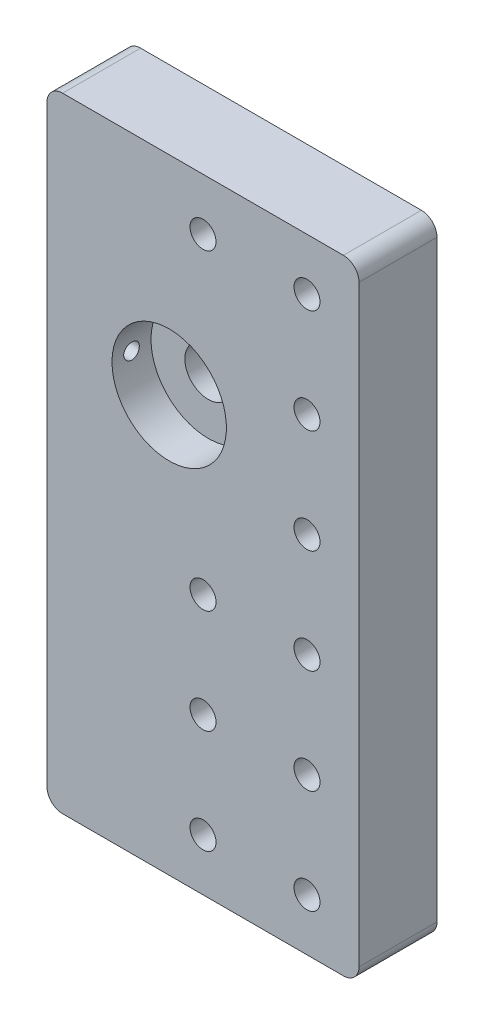
ISO-10303-21;
HEADER;
FILE_DESCRIPTION(('STEP AP214'),'2;1');
FILE_NAME('part.step','',(''),(''),'','','');
FILE_SCHEMA(('AUTOMOTIVE_DESIGN { 1 0 10303 214 1 1 1 1 }'));
ENDSEC;
DATA;
#1=APPLICATION_CONTEXT('core data for automotive mechanical design processes');
#2=APPLICATION_PROTOCOL_DEFINITION('international standard','automotive_design',2000,#1);
#3=PRODUCT_CONTEXT('',#1,'mechanical');
#4=PRODUCT('Part','Part','',(#3));
#5=PRODUCT_RELATED_PRODUCT_CATEGORY('part','',(#4));
#6=PRODUCT_DEFINITION_FORMATION('','',#4);
#7=PRODUCT_DEFINITION_CONTEXT('part definition',#1,'design');
#8=PRODUCT_DEFINITION('design','',#6,#7);
#9=PRODUCT_DEFINITION_SHAPE('','',#8);
#10=(LENGTH_UNIT() NAMED_UNIT(*) SI_UNIT(.MILLI.,.METRE.));
#11=(NAMED_UNIT(*) PLANE_ANGLE_UNIT() SI_UNIT($,.RADIAN.));
#12=(NAMED_UNIT(*) SI_UNIT($,.STERADIAN.) SOLID_ANGLE_UNIT());
#13=UNCERTAINTY_MEASURE_WITH_UNIT(LENGTH_MEASURE(1.E-05),#10,'distance_accuracy_value','');
#14=(GEOMETRIC_REPRESENTATION_CONTEXT(3) GLOBAL_UNCERTAINTY_ASSIGNED_CONTEXT((#13)) GLOBAL_UNIT_ASSIGNED_CONTEXT((#10,
#11,#12)) REPRESENTATION_CONTEXT('',''));
#15=CARTESIAN_POINT('',(0.,0.,0.));
#16=DIRECTION('',(0.,0.,1.));
#17=DIRECTION('',(1.,0.,0.));
#18=AXIS2_PLACEMENT_3D('',#15,#16,#17);
#19=CARTESIAN_POINT('',(83.5,80.,0.));
#20=DIRECTION('',(0.,0.,1.));
#21=DIRECTION('',(-1.,0.,0.));
#22=AXIS2_PLACEMENT_3D('',#19,#20,#21);
#23=CYLINDRICAL_SURFACE('',#22,4.5);
#24=CARTESIAN_POINT('',(83.5,80.,0.));
#25=DIRECTION('',(0.,0.,-1.));
#26=DIRECTION('',(-1.,0.,0.));
#27=AXIS2_PLACEMENT_3D('',#24,#25,#26);
#28=CIRCLE('',#27,4.5);
#29=CARTESIAN_POINT('',(79.,80.,0.));
#30=VERTEX_POINT('',#29);
#31=EDGE_CURVE('E289',#30,#30,#28,.T.);
#32=ORIENTED_EDGE('',*,*,#31,.T.);
#33=EDGE_LOOP('',(#32));
#34=FACE_BOUND('',#33,.T.);
#35=CARTESIAN_POINT('',(83.5,80.,7.5));
#36=DIRECTION('',(0.,0.,-1.));
#37=DIRECTION('',(-1.,0.,0.));
#38=AXIS2_PLACEMENT_3D('',#35,#36,#37);
#39=CIRCLE('',#38,4.5);
#40=CARTESIAN_POINT('',(79.,80.,7.5));
#41=VERTEX_POINT('',#40);
#42=EDGE_CURVE('E301',#41,#41,#39,.T.);
#43=ORIENTED_EDGE('',*,*,#42,.F.);
#44=EDGE_LOOP('',(#43));
#45=FACE_BOUND('',#44,.T.);
#46=ADVANCED_FACE('F42',(#34,#45),#23,.F.);
#47=CARTESIAN_POINT('',(120.,0.,15.));
#48=DIRECTION('',(0.,0.,-1.));
#49=DIRECTION('',(1.,0.,0.));
#50=AXIS2_PLACEMENT_3D('',#47,#48,#49);
#51=PLANE('',#50);
#52=CARTESIAN_POINT('',(83.5,80.,15.));
#53=DIRECTION('',(0.,0.,-1.));
#54=DIRECTION('',(-1.,0.,0.));
#55=AXIS2_PLACEMENT_3D('',#52,#53,#54);
#56=CIRCLE('',#55,11.);
#57=CARTESIAN_POINT('',(72.5,80.,15.));
#58=VERTEX_POINT('',#57);
#59=EDGE_CURVE('E297',#58,#58,#56,.T.);
#60=ORIENTED_EDGE('',*,*,#59,.T.);
#61=EDGE_LOOP('',(#60));
#62=FACE_BOUND('',#61,.T.);
#63=DIRECTION('',(0.,-1.,0.));
#64=VECTOR('',#63,1.);
#65=CARTESIAN_POINT('',(120.,0.,15.));
#66=LINE('',#65,#64);
#67=CARTESIAN_POINT('',(120.,117.,15.));
#68=VERTEX_POINT('',#67);
#69=CARTESIAN_POINT('',(120.,3.,15.));
#70=VERTEX_POINT('',#69);
#71=EDGE_CURVE('E153',#68,#70,#66,.T.);
#72=ORIENTED_EDGE('',*,*,#71,.F.);
#73=CARTESIAN_POINT('',(117.,117.,15.));
#74=DIRECTION('',(0.,0.,1.));
#75=DIRECTION('',(1.,0.,0.));
#76=AXIS2_PLACEMENT_3D('',#73,#74,#75);
#77=CIRCLE('',#76,3.);
#78=CARTESIAN_POINT('',(117.,120.,15.));
#79=VERTEX_POINT('',#78);
#80=EDGE_CURVE('E173',#79,#68,#77,.F.);
#81=ORIENTED_EDGE('',*,*,#80,.F.);
#82=DIRECTION('',(1.,0.,0.));
#83=VECTOR('',#82,1.);
#84=CARTESIAN_POINT('',(120.,120.,15.));
#85=LINE('',#84,#83);
#86=CARTESIAN_POINT('',(63.,120.,15.));
#87=VERTEX_POINT('',#86);
#88=EDGE_CURVE('E155',#87,#79,#85,.T.);
#89=ORIENTED_EDGE('',*,*,#88,.F.);
#90=CARTESIAN_POINT('',(63.,117.,15.));
#91=DIRECTION('',(0.,0.,1.));
#92=DIRECTION('',(1.,0.,0.));
#93=AXIS2_PLACEMENT_3D('',#90,#91,#92);
#94=CIRCLE('',#93,3.);
#95=CARTESIAN_POINT('',(60.,117.,15.));
#96=VERTEX_POINT('',#95);
#97=EDGE_CURVE('E170',#96,#87,#94,.F.);
#98=ORIENTED_EDGE('',*,*,#97,.F.);
#99=DIRECTION('',(0.,1.,0.));
#100=VECTOR('',#99,1.);
#101=CARTESIAN_POINT('',(60.,0.,15.));
#102=LINE('',#101,#100);
#103=CARTESIAN_POINT('',(60.,3.,15.));
#104=VERTEX_POINT('',#103);
#105=EDGE_CURVE('E200',#104,#96,#102,.T.);
#106=ORIENTED_EDGE('',*,*,#105,.F.);
#107=CARTESIAN_POINT('',(63.,3.,15.));
#108=DIRECTION('',(0.,0.,1.));
#109=DIRECTION('',(1.,0.,0.));
#110=AXIS2_PLACEMENT_3D('',#107,#108,#109);
#111=CIRCLE('',#110,3.);
#112=CARTESIAN_POINT('',(63.,0.,15.));
#113=VERTEX_POINT('',#112);
#114=EDGE_CURVE('E176',#113,#104,#111,.F.);
#115=ORIENTED_EDGE('',*,*,#114,.F.);
#116=DIRECTION('',(-1.,0.,0.));
#117=VECTOR('',#116,1.);
#118=CARTESIAN_POINT('',(120.,0.,15.));
#119=LINE('',#118,#117);
#120=CARTESIAN_POINT('',(117.,0.,15.));
#121=VERTEX_POINT('',#120);
#122=EDGE_CURVE('E204',#121,#113,#119,.T.);
#123=ORIENTED_EDGE('',*,*,#122,.F.);
#124=CARTESIAN_POINT('',(117.,3.,15.));
#125=DIRECTION('',(0.,0.,1.));
#126=DIRECTION('',(1.,0.,0.));
#127=AXIS2_PLACEMENT_3D('',#124,#125,#126);
#128=CIRCLE('',#127,3.);
#129=EDGE_CURVE('E112',#70,#121,#128,.F.);
#130=ORIENTED_EDGE('',*,*,#129,.F.);
#131=EDGE_LOOP('',(#72,#81,#89,#98,#106,#115,#123,#130));
#132=FACE_BOUND('',#131,.T.);
#133=CARTESIAN_POINT('',(110.,110.,15.));
#134=DIRECTION('',(0.,0.,-1.));
#135=DIRECTION('',(-1.,0.,0.));
#136=AXIS2_PLACEMENT_3D('',#133,#134,#135);
#137=CIRCLE('',#136,2.5);
#138=CARTESIAN_POINT('',(107.5,110.,15.));
#139=VERTEX_POINT('',#138);
#140=EDGE_CURVE('E146',#139,#139,#137,.T.);
#141=ORIENTED_EDGE('',*,*,#140,.T.);
#142=EDGE_LOOP('',(#141));
#143=FACE_BOUND('',#142,.T.);
#144=CARTESIAN_POINT('',(90.,110.,15.));
#145=DIRECTION('',(0.,0.,-1.));
#146=DIRECTION('',(-1.,0.,0.));
#147=AXIS2_PLACEMENT_3D('',#144,#145,#146);
#148=CIRCLE('',#147,2.5);
#149=CARTESIAN_POINT('',(87.5,110.,15.));
#150=VERTEX_POINT('',#149);
#151=EDGE_CURVE('E221',#150,#150,#148,.T.);
#152=ORIENTED_EDGE('',*,*,#151,.T.);
#153=EDGE_LOOP('',(#152));
#154=FACE_BOUND('',#153,.T.);
#155=CARTESIAN_POINT('',(110.,90.,15.));
#156=DIRECTION('',(0.,0.,-1.));
#157=DIRECTION('',(-1.,0.,0.));
#158=AXIS2_PLACEMENT_3D('',#155,#156,#157);
#159=CIRCLE('',#158,2.5);
#160=CARTESIAN_POINT('',(107.5,90.,15.));
#161=VERTEX_POINT('',#160);
#162=EDGE_CURVE('E229',#161,#161,#159,.T.);
#163=ORIENTED_EDGE('',*,*,#162,.T.);
#164=EDGE_LOOP('',(#163));
#165=FACE_BOUND('',#164,.T.);
#166=CARTESIAN_POINT('',(110.,70.,15.));
#167=DIRECTION('',(0.,0.,-1.));
#168=DIRECTION('',(-1.,0.,0.));
#169=AXIS2_PLACEMENT_3D('',#166,#167,#168);
#170=CIRCLE('',#169,2.5);
#171=CARTESIAN_POINT('',(107.5,70.,15.));
#172=VERTEX_POINT('',#171);
#173=EDGE_CURVE('E237',#172,#172,#170,.T.);
#174=ORIENTED_EDGE('',*,*,#173,.T.);
#175=EDGE_LOOP('',(#174));
#176=FACE_BOUND('',#175,.T.);
#177=CARTESIAN_POINT('',(110.,30.,15.));
#178=DIRECTION('',(0.,0.,-1.));
#179=DIRECTION('',(-1.,0.,0.));
#180=AXIS2_PLACEMENT_3D('',#177,#178,#179);
#181=CIRCLE('',#180,2.5);
#182=CARTESIAN_POINT('',(107.5,30.,15.));
#183=VERTEX_POINT('',#182);
#184=EDGE_CURVE('E244',#183,#183,#181,.T.);
#185=ORIENTED_EDGE('',*,*,#184,.T.);
#186=EDGE_LOOP('',(#185));
#187=FACE_BOUND('',#186,.T.);
#188=CARTESIAN_POINT('',(110.,10.,15.));
#189=DIRECTION('',(0.,0.,-1.));
#190=DIRECTION('',(-1.,0.,0.));
#191=AXIS2_PLACEMENT_3D('',#188,#189,#190);
#192=CIRCLE('',#191,2.5);
#193=CARTESIAN_POINT('',(107.5,10.,15.));
#194=VERTEX_POINT('',#193);
#195=EDGE_CURVE('E252',#194,#194,#192,.T.);
#196=ORIENTED_EDGE('',*,*,#195,.T.);
#197=EDGE_LOOP('',(#196));
#198=FACE_BOUND('',#197,.T.);
#199=CARTESIAN_POINT('',(90.,10.,15.));
#200=DIRECTION('',(0.,0.,-1.));
#201=DIRECTION('',(-1.,0.,0.));
#202=AXIS2_PLACEMENT_3D('',#199,#200,#201);
#203=CIRCLE('',#202,2.5);
#204=CARTESIAN_POINT('',(87.5,10.,15.));
#205=VERTEX_POINT('',#204);
#206=EDGE_CURVE('E259',#205,#205,#203,.T.);
#207=ORIENTED_EDGE('',*,*,#206,.T.);
#208=EDGE_LOOP('',(#207));
#209=FACE_BOUND('',#208,.T.);
#210=CARTESIAN_POINT('',(110.,50.,15.));
#211=DIRECTION('',(0.,0.,-1.));
#212=DIRECTION('',(-1.,0.,0.));
#213=AXIS2_PLACEMENT_3D('',#210,#211,#212);
#214=CIRCLE('',#213,2.5);
#215=CARTESIAN_POINT('',(107.5,50.,15.));
#216=VERTEX_POINT('',#215);
#217=EDGE_CURVE('E266',#216,#216,#214,.T.);
#218=ORIENTED_EDGE('',*,*,#217,.T.);
#219=EDGE_LOOP('',(#218));
#220=FACE_BOUND('',#219,.T.);
#221=CARTESIAN_POINT('',(90.,50.,15.));
#222=DIRECTION('',(0.,0.,-1.));
#223=DIRECTION('',(-1.,0.,0.));
#224=AXIS2_PLACEMENT_3D('',#221,#222,#223);
#225=CIRCLE('',#224,2.5);
#226=CARTESIAN_POINT('',(87.5,50.,15.));
#227=VERTEX_POINT('',#226);
#228=EDGE_CURVE('E274',#227,#227,#225,.T.);
#229=ORIENTED_EDGE('',*,*,#228,.T.);
#230=EDGE_LOOP('',(#229));
#231=FACE_BOUND('',#230,.T.);
#232=CARTESIAN_POINT('',(90.,30.,15.));
#233=DIRECTION('',(0.,0.,-1.));
#234=DIRECTION('',(-1.,0.,0.));
#235=AXIS2_PLACEMENT_3D('',#232,#233,#234);
#236=CIRCLE('',#235,2.5);
#237=CARTESIAN_POINT('',(87.5,30.,15.));
#238=VERTEX_POINT('',#237);
#239=EDGE_CURVE('E282',#238,#238,#236,.T.);
#240=ORIENTED_EDGE('',*,*,#239,.T.);
#241=EDGE_LOOP('',(#240));
#242=FACE_BOUND('',#241,.T.);
#243=ADVANCED_FACE('F207',(#62,#132,#143,#154,#165,#176,#187,#198,#209,#220,#231,#242),#51,.F.);
#244=CARTESIAN_POINT('',(120.,0.,0.));
#245=DIRECTION('',(0.,0.,-1.));
#246=DIRECTION('',(1.,0.,0.));
#247=AXIS2_PLACEMENT_3D('',#244,#245,#246);
#248=PLANE('',#247);
#249=ORIENTED_EDGE('',*,*,#31,.F.);
#250=EDGE_LOOP('',(#249));
#251=FACE_BOUND('',#250,.T.);
#252=CARTESIAN_POINT('',(90.,50.,0.));
#253=DIRECTION('',(0.,0.,-1.));
#254=DIRECTION('',(-1.,0.,0.));
#255=AXIS2_PLACEMENT_3D('',#252,#253,#254);
#256=CIRCLE('',#255,2.5);
#257=CARTESIAN_POINT('',(87.5,50.,0.));
#258=VERTEX_POINT('',#257);
#259=EDGE_CURVE('E278',#258,#258,#256,.T.);
#260=ORIENTED_EDGE('',*,*,#259,.F.);
#261=EDGE_LOOP('',(#260));
#262=FACE_BOUND('',#261,.T.);
#263=CARTESIAN_POINT('',(90.,10.,0.));
#264=DIRECTION('',(0.,0.,-1.));
#265=DIRECTION('',(-1.,0.,0.));
#266=AXIS2_PLACEMENT_3D('',#263,#264,#265);
#267=CIRCLE('',#266,2.5);
#268=CARTESIAN_POINT('',(87.5,10.,0.));
#269=VERTEX_POINT('',#268);
#270=EDGE_CURVE('E262',#269,#269,#267,.T.);
#271=ORIENTED_EDGE('',*,*,#270,.F.);
#272=EDGE_LOOP('',(#271));
#273=FACE_BOUND('',#272,.T.);
#274=CARTESIAN_POINT('',(110.,30.,0.));
#275=DIRECTION('',(0.,0.,-1.));
#276=DIRECTION('',(-1.,0.,0.));
#277=AXIS2_PLACEMENT_3D('',#274,#275,#276);
#278=CIRCLE('',#277,2.5);
#279=CARTESIAN_POINT('',(107.5,30.,0.));
#280=VERTEX_POINT('',#279);
#281=EDGE_CURVE('E248',#280,#280,#278,.T.);
#282=ORIENTED_EDGE('',*,*,#281,.F.);
#283=EDGE_LOOP('',(#282));
#284=FACE_BOUND('',#283,.T.);
#285=CARTESIAN_POINT('',(110.,90.,0.));
#286=DIRECTION('',(0.,0.,-1.));
#287=DIRECTION('',(-1.,0.,0.));
#288=AXIS2_PLACEMENT_3D('',#285,#286,#287);
#289=CIRCLE('',#288,2.5);
#290=CARTESIAN_POINT('',(107.5,90.,0.));
#291=VERTEX_POINT('',#290);
#292=EDGE_CURVE('E233',#291,#291,#289,.T.);
#293=ORIENTED_EDGE('',*,*,#292,.F.);
#294=EDGE_LOOP('',(#293));
#295=FACE_BOUND('',#294,.T.);
#296=CARTESIAN_POINT('',(110.,110.,0.));
#297=DIRECTION('',(0.,0.,-1.));
#298=DIRECTION('',(-1.,0.,0.));
#299=AXIS2_PLACEMENT_3D('',#296,#297,#298);
#300=CIRCLE('',#299,2.5);
#301=CARTESIAN_POINT('',(107.5,110.,0.));
#302=VERTEX_POINT('',#301);
#303=EDGE_CURVE('E217',#302,#302,#300,.T.);
#304=ORIENTED_EDGE('',*,*,#303,.F.);
#305=EDGE_LOOP('',(#304));
#306=FACE_BOUND('',#305,.T.);
#307=DIRECTION('',(-1.,0.,0.));
#308=VECTOR('',#307,1.);
#309=CARTESIAN_POINT('',(120.,0.,0.));
#310=LINE('',#309,#308);
#311=CARTESIAN_POINT('',(117.,0.,0.));
#312=VERTEX_POINT('',#311);
#313=CARTESIAN_POINT('',(63.,0.,0.));
#314=VERTEX_POINT('',#313);
#315=EDGE_CURVE('E126',#312,#314,#310,.T.);
#316=ORIENTED_EDGE('',*,*,#315,.T.);
#317=CARTESIAN_POINT('',(63.,3.,0.));
#318=DIRECTION('',(0.,0.,1.));
#319=DIRECTION('',(1.,0.,0.));
#320=AXIS2_PLACEMENT_3D('',#317,#318,#319);
#321=CIRCLE('',#320,3.);
#322=CARTESIAN_POINT('',(60.,3.,0.));
#323=VERTEX_POINT('',#322);
#324=EDGE_CURVE('E132',#323,#314,#321,.T.);
#325=ORIENTED_EDGE('',*,*,#324,.F.);
#326=DIRECTION('',(0.,1.,0.));
#327=VECTOR('',#326,1.);
#328=CARTESIAN_POINT('',(60.,0.,0.));
#329=LINE('',#328,#327);
#330=CARTESIAN_POINT('',(60.,117.,0.));
#331=VERTEX_POINT('',#330);
#332=EDGE_CURVE('E137',#323,#331,#329,.T.);
#333=ORIENTED_EDGE('',*,*,#332,.T.);
#334=CARTESIAN_POINT('',(63.,117.,0.));
#335=DIRECTION('',(0.,0.,1.));
#336=DIRECTION('',(1.,0.,0.));
#337=AXIS2_PLACEMENT_3D('',#334,#335,#336);
#338=CIRCLE('',#337,3.);
#339=CARTESIAN_POINT('',(63.,120.,0.));
#340=VERTEX_POINT('',#339);
#341=EDGE_CURVE('E118',#340,#331,#338,.T.);
#342=ORIENTED_EDGE('',*,*,#341,.F.);
#343=DIRECTION('',(1.,0.,0.));
#344=VECTOR('',#343,1.);
#345=CARTESIAN_POINT('',(120.,120.,0.));
#346=LINE('',#345,#344);
#347=CARTESIAN_POINT('',(117.,120.,0.));
#348=VERTEX_POINT('',#347);
#349=EDGE_CURVE('E143',#340,#348,#346,.T.);
#350=ORIENTED_EDGE('',*,*,#349,.T.);
#351=CARTESIAN_POINT('',(117.,117.,0.));
#352=DIRECTION('',(0.,0.,1.));
#353=DIRECTION('',(1.,0.,0.));
#354=AXIS2_PLACEMENT_3D('',#351,#352,#353);
#355=CIRCLE('',#354,3.);
#356=CARTESIAN_POINT('',(120.,117.,0.));
#357=VERTEX_POINT('',#356);
#358=EDGE_CURVE('E160',#357,#348,#355,.T.);
#359=ORIENTED_EDGE('',*,*,#358,.F.);
#360=DIRECTION('',(0.,-1.,0.));
#361=VECTOR('',#360,1.);
#362=CARTESIAN_POINT('',(120.,0.,0.));
#363=LINE('',#362,#361);
#364=CARTESIAN_POINT('',(120.,3.,0.));
#365=VERTEX_POINT('',#364);
#366=EDGE_CURVE('E129',#357,#365,#363,.T.);
#367=ORIENTED_EDGE('',*,*,#366,.T.);
#368=CARTESIAN_POINT('',(117.,3.,0.));
#369=DIRECTION('',(0.,0.,1.));
#370=DIRECTION('',(1.,0.,0.));
#371=AXIS2_PLACEMENT_3D('',#368,#369,#370);
#372=CIRCLE('',#371,3.);
#373=EDGE_CURVE('E109',#312,#365,#372,.T.);
#374=ORIENTED_EDGE('',*,*,#373,.F.);
#375=EDGE_LOOP('',(#316,#325,#333,#342,#350,#359,#367,#374));
#376=FACE_BOUND('',#375,.T.);
#377=CARTESIAN_POINT('',(90.,110.,0.));
#378=DIRECTION('',(0.,0.,-1.));
#379=DIRECTION('',(-1.,0.,0.));
#380=AXIS2_PLACEMENT_3D('',#377,#378,#379);
#381=CIRCLE('',#380,2.5);
#382=CARTESIAN_POINT('',(87.5,110.,0.));
#383=VERTEX_POINT('',#382);
#384=EDGE_CURVE('E225',#383,#383,#381,.T.);
#385=ORIENTED_EDGE('',*,*,#384,.F.);
#386=EDGE_LOOP('',(#385));
#387=FACE_BOUND('',#386,.T.);
#388=CARTESIAN_POINT('',(110.,70.,0.));
#389=DIRECTION('',(0.,0.,-1.));
#390=DIRECTION('',(-1.,0.,0.));
#391=AXIS2_PLACEMENT_3D('',#388,#389,#390);
#392=CIRCLE('',#391,2.5);
#393=CARTESIAN_POINT('',(107.5,70.,0.));
#394=VERTEX_POINT('',#393);
#395=EDGE_CURVE('E240',#394,#394,#392,.T.);
#396=ORIENTED_EDGE('',*,*,#395,.F.);
#397=EDGE_LOOP('',(#396));
#398=FACE_BOUND('',#397,.T.);
#399=CARTESIAN_POINT('',(110.,10.,0.));
#400=DIRECTION('',(0.,0.,-1.));
#401=DIRECTION('',(-1.,0.,0.));
#402=AXIS2_PLACEMENT_3D('',#399,#400,#401);
#403=CIRCLE('',#402,2.5);
#404=CARTESIAN_POINT('',(107.5,10.,0.));
#405=VERTEX_POINT('',#404);
#406=EDGE_CURVE('E256',#405,#405,#403,.T.);
#407=ORIENTED_EDGE('',*,*,#406,.F.);
#408=EDGE_LOOP('',(#407));
#409=FACE_BOUND('',#408,.T.);
#410=CARTESIAN_POINT('',(110.,50.,0.));
#411=DIRECTION('',(0.,0.,-1.));
#412=DIRECTION('',(-1.,0.,0.));
#413=AXIS2_PLACEMENT_3D('',#410,#411,#412);
#414=CIRCLE('',#413,2.5);
#415=CARTESIAN_POINT('',(107.5,50.,0.));
#416=VERTEX_POINT('',#415);
#417=EDGE_CURVE('E270',#416,#416,#414,.T.);
#418=ORIENTED_EDGE('',*,*,#417,.F.);
#419=EDGE_LOOP('',(#418));
#420=FACE_BOUND('',#419,.T.);
#421=CARTESIAN_POINT('',(90.,30.,0.));
#422=DIRECTION('',(0.,0.,-1.));
#423=DIRECTION('',(-1.,0.,0.));
#424=AXIS2_PLACEMENT_3D('',#421,#422,#423);
#425=CIRCLE('',#424,2.5);
#426=CARTESIAN_POINT('',(87.5,30.,0.));
#427=VERTEX_POINT('',#426);
#428=EDGE_CURVE('E285',#427,#427,#425,.T.);
#429=ORIENTED_EDGE('',*,*,#428,.F.);
#430=EDGE_LOOP('',(#429));
#431=FACE_BOUND('',#430,.T.);
#432=ADVANCED_FACE('F123',(#251,#262,#273,#284,#295,#306,#376,#387,#398,#409,#420,#431),#248,.T.);
#433=CARTESIAN_POINT('',(120.,0.,15.));
#434=DIRECTION('',(-1.,0.,0.));
#435=DIRECTION('',(0.,0.,-1.));
#436=AXIS2_PLACEMENT_3D('',#433,#434,#435);
#437=PLANE('',#436);
#438=ORIENTED_EDGE('',*,*,#366,.F.);
#439=DIRECTION('',(0.,0.,-1.));
#440=VECTOR('',#439,1.);
#441=CARTESIAN_POINT('',(120.,117.,15.));
#442=LINE('',#441,#440);
#443=EDGE_CURVE('E131',#68,#357,#442,.T.);
#444=ORIENTED_EDGE('',*,*,#443,.F.);
#445=ORIENTED_EDGE('',*,*,#71,.T.);
#446=DIRECTION('',(0.,0.,-1.));
#447=VECTOR('',#446,1.);
#448=CARTESIAN_POINT('',(120.,3.,15.));
#449=LINE('',#448,#447);
#450=EDGE_CURVE('E167',#365,#70,#449,.F.);
#451=ORIENTED_EDGE('',*,*,#450,.F.);
#452=EDGE_LOOP('',(#438,#444,#445,#451));
#453=FACE_BOUND('',#452,.T.);
#454=ADVANCED_FACE('F382',(#453),#437,.F.);
#455=CARTESIAN_POINT('',(120.,0.,15.));
#456=DIRECTION('',(0.,1.,0.));
#457=DIRECTION('',(0.,0.,1.));
#458=AXIS2_PLACEMENT_3D('',#455,#456,#457);
#459=PLANE('',#458);
#460=ORIENTED_EDGE('',*,*,#122,.T.);
#461=DIRECTION('',(0.,0.,-1.));
#462=VECTOR('',#461,1.);
#463=CARTESIAN_POINT('',(63.,0.,15.));
#464=LINE('',#463,#462);
#465=EDGE_CURVE('E119',#314,#113,#464,.F.);
#466=ORIENTED_EDGE('',*,*,#465,.F.);
#467=ORIENTED_EDGE('',*,*,#315,.F.);
#468=DIRECTION('',(0.,0.,-1.));
#469=VECTOR('',#468,1.);
#470=CARTESIAN_POINT('',(117.,0.,15.));
#471=LINE('',#470,#469);
#472=EDGE_CURVE('E106',#121,#312,#471,.T.);
#473=ORIENTED_EDGE('',*,*,#472,.F.);
#474=EDGE_LOOP('',(#460,#466,#467,#473));
#475=FACE_BOUND('',#474,.T.);
#476=ADVANCED_FACE('F134',(#475),#459,.F.);
#477=CARTESIAN_POINT('',(60.,0.,15.));
#478=DIRECTION('',(1.,0.,0.));
#479=DIRECTION('',(0.,0.,1.));
#480=AXIS2_PLACEMENT_3D('',#477,#478,#479);
#481=PLANE('',#480);
#482=CARTESIAN_POINT('',(60.,80.,11.25));
#483=DIRECTION('',(-1.,0.,0.));
#484=DIRECTION('',(0.,0.,1.));
#485=AXIS2_PLACEMENT_3D('',#482,#483,#484);
#486=CIRCLE('',#485,1.5);
#487=CARTESIAN_POINT('',(60.,80.,12.75));
#488=VERTEX_POINT('',#487);
#489=EDGE_CURVE('E302',#488,#488,#486,.T.);
#490=ORIENTED_EDGE('',*,*,#489,.F.);
#491=EDGE_LOOP('',(#490));
#492=FACE_BOUND('',#491,.T.);
#493=ORIENTED_EDGE('',*,*,#105,.T.);
#494=DIRECTION('',(0.,0.,-1.));
#495=VECTOR('',#494,1.);
#496=CARTESIAN_POINT('',(60.,117.,15.));
#497=LINE('',#496,#495);
#498=EDGE_CURVE('E182',#331,#96,#497,.F.);
#499=ORIENTED_EDGE('',*,*,#498,.F.);
#500=ORIENTED_EDGE('',*,*,#332,.F.);
#501=DIRECTION('',(0.,0.,-1.));
#502=VECTOR('',#501,1.);
#503=CARTESIAN_POINT('',(60.,3.,15.));
#504=LINE('',#503,#502);
#505=EDGE_CURVE('E185',#104,#323,#504,.T.);
#506=ORIENTED_EDGE('',*,*,#505,.F.);
#507=EDGE_LOOP('',(#493,#499,#500,#506));
#508=FACE_BOUND('',#507,.T.);
#509=ADVANCED_FACE('F198',(#492,#508),#481,.F.);
#510=CARTESIAN_POINT('',(120.,120.,15.));
#511=DIRECTION('',(0.,-1.,0.));
#512=DIRECTION('',(0.,0.,-1.));
#513=AXIS2_PLACEMENT_3D('',#510,#511,#512);
#514=PLANE('',#513);
#515=ORIENTED_EDGE('',*,*,#349,.F.);
#516=DIRECTION('',(0.,0.,-1.));
#517=VECTOR('',#516,1.);
#518=CARTESIAN_POINT('',(63.,120.,15.));
#519=LINE('',#518,#517);
#520=EDGE_CURVE('E51',#87,#340,#519,.T.);
#521=ORIENTED_EDGE('',*,*,#520,.F.);
#522=ORIENTED_EDGE('',*,*,#88,.T.);
#523=DIRECTION('',(0.,0.,-1.));
#524=VECTOR('',#523,1.);
#525=CARTESIAN_POINT('',(117.,120.,15.));
#526=LINE('',#525,#524);
#527=EDGE_CURVE('E11',#348,#79,#526,.F.);
#528=ORIENTED_EDGE('',*,*,#527,.F.);
#529=EDGE_LOOP('',(#515,#521,#522,#528));
#530=FACE_BOUND('',#529,.T.);
#531=ADVANCED_FACE('F194',(#530),#514,.F.);
#532=CARTESIAN_POINT('',(110.,110.,15.));
#533=DIRECTION('',(0.,0.,-1.));
#534=DIRECTION('',(1.,0.,0.));
#535=AXIS2_PLACEMENT_3D('',#532,#533,#534);
#536=CYLINDRICAL_SURFACE('',#535,2.5);
#537=ORIENTED_EDGE('',*,*,#140,.F.);
#538=EDGE_LOOP('',(#537));
#539=FACE_BOUND('',#538,.T.);
#540=ORIENTED_EDGE('',*,*,#303,.T.);
#541=EDGE_LOOP('',(#540));
#542=FACE_BOUND('',#541,.T.);
#543=ADVANCED_FACE('F372',(#539,#542),#536,.F.);
#544=CARTESIAN_POINT('',(90.,110.,15.));
#545=DIRECTION('',(0.,0.,-1.));
#546=DIRECTION('',(1.,0.,0.));
#547=AXIS2_PLACEMENT_3D('',#544,#545,#546);
#548=CYLINDRICAL_SURFACE('',#547,2.5);
#549=ORIENTED_EDGE('',*,*,#151,.F.);
#550=EDGE_LOOP('',(#549));
#551=FACE_BOUND('',#550,.T.);
#552=ORIENTED_EDGE('',*,*,#384,.T.);
#553=EDGE_LOOP('',(#552));
#554=FACE_BOUND('',#553,.T.);
#555=ADVANCED_FACE('F368',(#551,#554),#548,.F.);
#556=CARTESIAN_POINT('',(110.,90.,15.));
#557=DIRECTION('',(0.,0.,-1.));
#558=DIRECTION('',(1.,0.,0.));
#559=AXIS2_PLACEMENT_3D('',#556,#557,#558);
#560=CYLINDRICAL_SURFACE('',#559,2.5);
#561=ORIENTED_EDGE('',*,*,#162,.F.);
#562=EDGE_LOOP('',(#561));
#563=FACE_BOUND('',#562,.T.);
#564=ORIENTED_EDGE('',*,*,#292,.T.);
#565=EDGE_LOOP('',(#564));
#566=FACE_BOUND('',#565,.T.);
#567=ADVANCED_FACE('F364',(#563,#566),#560,.F.);
#568=CARTESIAN_POINT('',(110.,70.,15.));
#569=DIRECTION('',(0.,0.,-1.));
#570=DIRECTION('',(1.,0.,0.));
#571=AXIS2_PLACEMENT_3D('',#568,#569,#570);
#572=CYLINDRICAL_SURFACE('',#571,2.5);
#573=ORIENTED_EDGE('',*,*,#173,.F.);
#574=EDGE_LOOP('',(#573));
#575=FACE_BOUND('',#574,.T.);
#576=ORIENTED_EDGE('',*,*,#395,.T.);
#577=EDGE_LOOP('',(#576));
#578=FACE_BOUND('',#577,.T.);
#579=ADVANCED_FACE('F360',(#575,#578),#572,.F.);
#580=CARTESIAN_POINT('',(110.,30.,15.));
#581=DIRECTION('',(0.,0.,-1.));
#582=DIRECTION('',(1.,0.,0.));
#583=AXIS2_PLACEMENT_3D('',#580,#581,#582);
#584=CYLINDRICAL_SURFACE('',#583,2.5);
#585=ORIENTED_EDGE('',*,*,#184,.F.);
#586=EDGE_LOOP('',(#585));
#587=FACE_BOUND('',#586,.T.);
#588=ORIENTED_EDGE('',*,*,#281,.T.);
#589=EDGE_LOOP('',(#588));
#590=FACE_BOUND('',#589,.T.);
#591=ADVANCED_FACE('F356',(#587,#590),#584,.F.);
#592=CARTESIAN_POINT('',(110.,10.,15.));
#593=DIRECTION('',(0.,0.,-1.));
#594=DIRECTION('',(1.,0.,0.));
#595=AXIS2_PLACEMENT_3D('',#592,#593,#594);
#596=CYLINDRICAL_SURFACE('',#595,2.5);
#597=ORIENTED_EDGE('',*,*,#195,.F.);
#598=EDGE_LOOP('',(#597));
#599=FACE_BOUND('',#598,.T.);
#600=ORIENTED_EDGE('',*,*,#406,.T.);
#601=EDGE_LOOP('',(#600));
#602=FACE_BOUND('',#601,.T.);
#603=ADVANCED_FACE('F352',(#599,#602),#596,.F.);
#604=CARTESIAN_POINT('',(90.,10.,15.));
#605=DIRECTION('',(0.,0.,-1.));
#606=DIRECTION('',(1.,0.,0.));
#607=AXIS2_PLACEMENT_3D('',#604,#605,#606);
#608=CYLINDRICAL_SURFACE('',#607,2.5);
#609=ORIENTED_EDGE('',*,*,#206,.F.);
#610=EDGE_LOOP('',(#609));
#611=FACE_BOUND('',#610,.T.);
#612=ORIENTED_EDGE('',*,*,#270,.T.);
#613=EDGE_LOOP('',(#612));
#614=FACE_BOUND('',#613,.T.);
#615=ADVANCED_FACE('F348',(#611,#614),#608,.F.);
#616=CARTESIAN_POINT('',(110.,50.,15.));
#617=DIRECTION('',(0.,0.,-1.));
#618=DIRECTION('',(1.,0.,0.));
#619=AXIS2_PLACEMENT_3D('',#616,#617,#618);
#620=CYLINDRICAL_SURFACE('',#619,2.5);
#621=ORIENTED_EDGE('',*,*,#217,.F.);
#622=EDGE_LOOP('',(#621));
#623=FACE_BOUND('',#622,.T.);
#624=ORIENTED_EDGE('',*,*,#417,.T.);
#625=EDGE_LOOP('',(#624));
#626=FACE_BOUND('',#625,.T.);
#627=ADVANCED_FACE('F344',(#623,#626),#620,.F.);
#628=CARTESIAN_POINT('',(90.,50.,15.));
#629=DIRECTION('',(0.,0.,-1.));
#630=DIRECTION('',(1.,0.,0.));
#631=AXIS2_PLACEMENT_3D('',#628,#629,#630);
#632=CYLINDRICAL_SURFACE('',#631,2.5);
#633=ORIENTED_EDGE('',*,*,#228,.F.);
#634=EDGE_LOOP('',(#633));
#635=FACE_BOUND('',#634,.T.);
#636=ORIENTED_EDGE('',*,*,#259,.T.);
#637=EDGE_LOOP('',(#636));
#638=FACE_BOUND('',#637,.T.);
#639=ADVANCED_FACE('F340',(#635,#638),#632,.F.);
#640=CARTESIAN_POINT('',(90.,30.,15.));
#641=DIRECTION('',(0.,0.,-1.));
#642=DIRECTION('',(1.,0.,0.));
#643=AXIS2_PLACEMENT_3D('',#640,#641,#642);
#644=CYLINDRICAL_SURFACE('',#643,2.5);
#645=ORIENTED_EDGE('',*,*,#239,.F.);
#646=EDGE_LOOP('',(#645));
#647=FACE_BOUND('',#646,.T.);
#648=ORIENTED_EDGE('',*,*,#428,.T.);
#649=EDGE_LOOP('',(#648));
#650=FACE_BOUND('',#649,.T.);
#651=ADVANCED_FACE('F337',(#647,#650),#644,.F.);
#652=CARTESIAN_POINT('',(117.,3.,15.));
#653=DIRECTION('',(0.,0.,-1.));
#654=DIRECTION('',(1.,0.,0.));
#655=AXIS2_PLACEMENT_3D('',#652,#653,#654);
#656=CYLINDRICAL_SURFACE('',#655,3.);
#657=ORIENTED_EDGE('',*,*,#129,.T.);
#658=ORIENTED_EDGE('',*,*,#472,.T.);
#659=ORIENTED_EDGE('',*,*,#373,.T.);
#660=ORIENTED_EDGE('',*,*,#450,.T.);
#661=EDGE_LOOP('',(#657,#658,#659,#660));
#662=FACE_BOUND('',#661,.T.);
#663=ADVANCED_FACE('F108',(#662),#656,.T.);
#664=CARTESIAN_POINT('',(63.,3.,15.));
#665=DIRECTION('',(0.,0.,-1.));
#666=DIRECTION('',(1.,0.,0.));
#667=AXIS2_PLACEMENT_3D('',#664,#665,#666);
#668=CYLINDRICAL_SURFACE('',#667,3.);
#669=ORIENTED_EDGE('',*,*,#114,.T.);
#670=ORIENTED_EDGE('',*,*,#505,.T.);
#671=ORIENTED_EDGE('',*,*,#324,.T.);
#672=ORIENTED_EDGE('',*,*,#465,.T.);
#673=EDGE_LOOP('',(#669,#670,#671,#672));
#674=FACE_BOUND('',#673,.T.);
#675=ADVANCED_FACE('F396',(#674),#668,.T.);
#676=CARTESIAN_POINT('',(117.,117.,15.));
#677=DIRECTION('',(0.,0.,-1.));
#678=DIRECTION('',(1.,0.,0.));
#679=AXIS2_PLACEMENT_3D('',#676,#677,#678);
#680=CYLINDRICAL_SURFACE('',#679,3.);
#681=ORIENTED_EDGE('',*,*,#80,.T.);
#682=ORIENTED_EDGE('',*,*,#443,.T.);
#683=ORIENTED_EDGE('',*,*,#358,.T.);
#684=ORIENTED_EDGE('',*,*,#527,.T.);
#685=EDGE_LOOP('',(#681,#682,#683,#684));
#686=FACE_BOUND('',#685,.T.);
#687=ADVANCED_FACE('F398',(#686),#680,.T.);
#688=CARTESIAN_POINT('',(63.,117.,15.));
#689=DIRECTION('',(0.,0.,-1.));
#690=DIRECTION('',(1.,0.,0.));
#691=AXIS2_PLACEMENT_3D('',#688,#689,#690);
#692=CYLINDRICAL_SURFACE('',#691,3.);
#693=ORIENTED_EDGE('',*,*,#97,.T.);
#694=ORIENTED_EDGE('',*,*,#520,.T.);
#695=ORIENTED_EDGE('',*,*,#341,.T.);
#696=ORIENTED_EDGE('',*,*,#498,.T.);
#697=EDGE_LOOP('',(#693,#694,#695,#696));
#698=FACE_BOUND('',#697,.T.);
#699=ADVANCED_FACE('F44',(#698),#692,.T.);
#700=CARTESIAN_POINT('',(83.5,80.,7.5));
#701=DIRECTION('',(0.,0.,1.));
#702=DIRECTION('',(-1.,0.,0.));
#703=AXIS2_PLACEMENT_3D('',#700,#701,#702);
#704=CYLINDRICAL_SURFACE('',#703,11.);
#705=CARTESIAN_POINT('',(72.5,80.,12.75));
#706=CARTESIAN_POINT('',(72.5000012532738,79.9161615865701,12.7499964805426));
#707=CARTESIAN_POINT('',(72.5009685728512,79.8322723977103,12.7429474073274));
#708=CARTESIAN_POINT('',(72.5047343359155,79.6668329023586,12.7149411167757));
#709=CARTESIAN_POINT('',(72.507534635599,79.5852850543401,12.6939698005502));
#710=CARTESIAN_POINT('',(72.5146512260171,79.4269469063064,12.6387522661594));
#711=CARTESIAN_POINT('',(72.5189664416081,79.3501532775468,12.6045154607979));
#712=CARTESIAN_POINT('',(72.528634272777,79.2034146975503,12.5237604754398));
#713=CARTESIAN_POINT('',(72.5339867250994,79.1334686711413,12.4772442277457));
#714=CARTESIAN_POINT('',(72.5451714003075,79.0019424361877,12.3729277857077));
#715=CARTESIAN_POINT('',(72.5510062309478,78.9404132153762,12.3150635769965));
#716=CARTESIAN_POINT('',(72.5624772844068,78.8279066609195,12.1898313892076));
#717=CARTESIAN_POINT('',(72.5681134965475,78.776929893872,12.1224629001387));
#718=CARTESIAN_POINT('',(72.5785746222812,78.6867814947507,11.9797980617759));
#719=CARTESIAN_POINT('',(72.583396169892,78.647658335316,11.9044708149948));
#720=CARTESIAN_POINT('',(72.5916470593224,78.5826373551472,11.7482381846263));
#721=CARTESIAN_POINT('',(72.595076463827,78.5567389389201,11.6673330523902));
#722=CARTESIAN_POINT('',(72.6001295030783,78.5190590944491,11.5027737564264));
#723=CARTESIAN_POINT('',(72.6017642177551,78.5071910113545,11.4191397807089));
#724=CARTESIAN_POINT('',(72.6030765619518,78.4976404494033,11.2510525269759));
#725=CARTESIAN_POINT('',(72.6027542846692,78.4999572950202,11.1665992881672));
#726=CARTESIAN_POINT('',(72.6001991966344,78.5186398298076,10.9998782743991));
#727=CARTESIAN_POINT('',(72.5979794289804,78.5349096108241,10.9175995236328));
#728=CARTESIAN_POINT('',(72.5918998259182,78.580886323047,10.7569509594673));
#729=CARTESIAN_POINT('',(72.588039951545,78.6105935734975,10.678581238987));
#730=CARTESIAN_POINT('',(72.579100417063,78.6827035823979,10.5276800739624));
#731=CARTESIAN_POINT('',(72.5740168072425,78.7251475614224,10.455168570732));
#732=CARTESIAN_POINT('',(72.5632055566531,78.8214967695518,10.3182608511142));
#733=CARTESIAN_POINT('',(72.5574778808782,78.8754026217696,10.2538650762333));
#734=CARTESIAN_POINT('',(72.545966026102,78.993674722162,10.1344604455054));
#735=CARTESIAN_POINT('',(72.5401817705892,79.0581235492658,10.0795333596876));
#736=CARTESIAN_POINT('',(72.5292525294221,79.1953690555946,9.98126350840162));
#737=CARTESIAN_POINT('',(72.5241075457602,79.2681657608354,9.93792077903695));
#738=CARTESIAN_POINT('',(72.5150324591229,79.4201070305195,9.86404813681997));
#739=CARTESIAN_POINT('',(72.5111028905153,79.4992543678687,9.83352385760728));
#740=CARTESIAN_POINT('',(72.5049060479693,79.6616169120601,9.7862221620544));
#741=CARTESIAN_POINT('',(72.502638681308,79.7448318917199,9.76944397890651));
#742=CARTESIAN_POINT('',(72.5000338619625,79.9122610926323,9.75021791543442));
#743=CARTESIAN_POINT('',(72.4996812530986,79.9964621636121,9.74765749141139));
#744=CARTESIAN_POINT('',(72.5009046122902,80.1640922940892,9.75664187833073));
#745=CARTESIAN_POINT('',(72.5024805312617,80.2475213731804,9.76818633028291));
#746=CARTESIAN_POINT('',(72.5073744734208,80.4109033783649,9.80495922320966));
#747=CARTESIAN_POINT('',(72.5106855987668,80.4908687206206,9.83013349557132));
#748=CARTESIAN_POINT('',(72.5186795593637,80.6454431410956,9.89339475903291));
#749=CARTESIAN_POINT('',(72.5233624490969,80.7200520064252,9.93148226301717));
#750=CARTESIAN_POINT('',(72.5336163696397,80.8622948929824,10.019757538724));
#751=CARTESIAN_POINT('',(72.539192629429,80.9298837283532,10.0700175028004));
#752=CARTESIAN_POINT('',(72.5505944685733,81.0557070132546,10.1811095779574));
#753=CARTESIAN_POINT('',(72.5564200597808,81.1139410174533,10.2419421920567));
#754=CARTESIAN_POINT('',(72.5677113122697,81.2198053295411,10.3729508330084));
#755=CARTESIAN_POINT('',(72.5731742498786,81.2673606638064,10.4431877134811));
#756=CARTESIAN_POINT('',(72.5830753495584,81.3499983954926,10.5907183076998));
#757=CARTESIAN_POINT('',(72.5875135353765,81.3850810819614,10.6680118578586));
#758=CARTESIAN_POINT('',(72.5948435273933,81.4416584950515,10.8272277566732));
#759=CARTESIAN_POINT('',(72.597740001028,81.4631942705001,10.9091352944361));
#760=CARTESIAN_POINT('',(72.6016715683977,81.4921981054752,11.075446521828));
#761=CARTESIAN_POINT('',(72.6027067666591,81.499666954979,11.1598500710143));
#762=CARTESIAN_POINT('',(72.6027951458473,81.5003085658472,11.328010975391));
#763=CARTESIAN_POINT('',(72.6018646613795,81.4935991469064,11.4117678966084));
#764=CARTESIAN_POINT('',(72.5981617994635,81.4663254643853,11.5769511386985));
#765=CARTESIAN_POINT('',(72.5953894230665,81.4457612087119,11.6583774609012));
#766=CARTESIAN_POINT('',(72.5883204918021,81.3914005645048,11.8165651393851));
#767=CARTESIAN_POINT('',(72.5840247196071,81.3576109698069,11.8933288674825));
#768=CARTESIAN_POINT('',(72.574391888755,81.2777703983912,12.0401162986064));
#769=CARTESIAN_POINT('',(72.5690548073377,81.2317191536582,12.1101398542605));
#770=CARTESIAN_POINT('',(72.5578877007815,81.1282291522308,12.2420600365998));
#771=CARTESIAN_POINT('',(72.5520540943964,81.070702784234,12.3038876362225));
#772=CARTESIAN_POINT('',(72.5405821269644,80.9460798680536,12.4170553467108));
#773=CARTESIAN_POINT('',(72.5349438119584,80.8789810819578,12.4683929983114));
#774=CARTESIAN_POINT('',(72.5244690703008,80.736765493202,12.5593259673834));
#775=CARTESIAN_POINT('',(72.5196363835438,80.6616138185173,12.5988671582763));
#776=CARTESIAN_POINT('',(72.5113546294284,80.5057096939303,12.664709481053));
#777=CARTESIAN_POINT('',(72.5079040897228,80.4249633120219,12.6910247096937));
#778=CARTESIAN_POINT('',(72.5035882393269,80.2865185970872,12.7235104370639));
#779=CARTESIAN_POINT('',(72.5022493572114,80.229685788696,12.7334293607973));
#780=CARTESIAN_POINT('',(72.5004548109262,80.1152433136469,12.7466753209812));
#781=CARTESIAN_POINT('',(72.4999991384528,80.0576336542977,12.7500024194064));
#782=CARTESIAN_POINT('',(72.5,80.,12.75));
#783=B_SPLINE_CURVE_WITH_KNOTS('',3,(#705,#706,#707,#708,#709,#710,#711,#712,#713,#714,#715,
#716,#717,#718,#719,#720,#721,#722,#723,#724,#725,#726,#727,#728,#729,#730,#731,#732,#733,#734,
#735,#736,#737,#738,#739,#740,#741,#742,#743,#744,#745,#746,#747,#748,#749,#750,#751,#752,#753,
#754,#755,#756,#757,#758,#759,#760,#761,#762,#763,#764,#765,#766,#767,#768,#769,#770,#771,#772,
#773,#774,#775,#776,#777,#778,#779,#780,#781,#782),.UNSPECIFIED.,.T.,.F.,(4,2,2,2,2,2,2,2,2,2,2,
2,2,2,2,2,2,2,2,2,2,2,2,2,2,2,2,2,2,2,2,2,2,2,2,2,2,2,4),(0.,0.25130468808613,0.502864258429492,
0.754245655375313,1.00558751830525,1.25839025869504,1.51120656941611,1.76504317927172,
2.01886835818389,2.27111752000617,2.52335466910191,2.77387178872724,3.02439486038875,
3.27573762185035,3.52709405079555,3.78052284746839,4.0339524339601,4.28749328511461,
4.54101999186669,4.79253696204824,5.0440475308801,5.29456578809545,5.54509399649482,
5.79714607697892,6.04921015271755,6.30299215129409,6.5567682682073,6.80977166004952,
7.0627608431786,7.3136559874506,7.56455098853992,7.81531727406241,8.0660890412842,
8.31885423544368,8.5716786200941,8.82564582024678,9.0793417549426,9.25209960062626,
9.42485582207674),.UNSPECIFIED.);
#784=CARTESIAN_POINT('',(72.5,80.,12.75));
#785=VERTEX_POINT('',#784);
#786=EDGE_CURVE('E312',#785,#785,#783,.T.);
#787=ORIENTED_EDGE('',*,*,#786,.F.);
#788=EDGE_LOOP('',(#787));
#789=FACE_BOUND('',#788,.T.);
#790=CARTESIAN_POINT('',(83.5,80.,7.5));
#791=DIRECTION('',(0.,0.,-1.));
#792=DIRECTION('',(-1.,0.,0.));
#793=AXIS2_PLACEMENT_3D('',#790,#791,#792);
#794=CIRCLE('',#793,11.);
#795=CARTESIAN_POINT('',(72.5,80.,7.5));
#796=VERTEX_POINT('',#795);
#797=EDGE_CURVE('E296',#796,#796,#794,.T.);
#798=ORIENTED_EDGE('',*,*,#797,.T.);
#799=EDGE_LOOP('',(#798));
#800=FACE_BOUND('',#799,.T.);
#801=ORIENTED_EDGE('',*,*,#59,.F.);
#802=EDGE_LOOP('',(#801));
#803=FACE_BOUND('',#802,.T.);
#804=ADVANCED_FACE('F329',(#789,#800,#803),#704,.F.);
#805=CARTESIAN_POINT('',(120.,0.,7.5));
#806=DIRECTION('',(0.,0.,1.));
#807=DIRECTION('',(-1.,0.,0.));
#808=AXIS2_PLACEMENT_3D('',#805,#806,#807);
#809=PLANE('',#808);
#810=ORIENTED_EDGE('',*,*,#42,.T.);
#811=EDGE_LOOP('',(#810));
#812=FACE_BOUND('',#811,.T.);
#813=ORIENTED_EDGE('',*,*,#797,.F.);
#814=EDGE_LOOP('',(#813));
#815=FACE_BOUND('',#814,.T.);
#816=ADVANCED_FACE('F325',(#812,#815),#809,.T.);
#817=CARTESIAN_POINT('',(120.001,80.,11.25));
#818=DIRECTION('',(-1.,0.,0.));
#819=DIRECTION('',(0.,0.,1.));
#820=AXIS2_PLACEMENT_3D('',#817,#818,#819);
#821=CYLINDRICAL_SURFACE('',#820,1.5);
#822=ORIENTED_EDGE('',*,*,#489,.T.);
#823=EDGE_LOOP('',(#822));
#824=FACE_BOUND('',#823,.T.);
#825=ORIENTED_EDGE('',*,*,#786,.T.);
#826=EDGE_LOOP('',(#825));
#827=FACE_BOUND('',#826,.T.);
#828=ADVANCED_FACE('F320',(#824,#827),#821,.F.);
#829=CLOSED_SHELL('',(#46,#243,#432,#454,#476,#509,#531,#543,#555,#567,#579,#591,#603,#615,#627,
#639,#651,#663,#675,#687,#699,#804,#816,#828));
#830=MANIFOLD_SOLID_BREP('B2',#829);
#831=ADVANCED_BREP_SHAPE_REPRESENTATION('',(#18,#830),#14);
#832=SHAPE_DEFINITION_REPRESENTATION(#9,#831);
ENDSEC;
END-ISO-10303-21;
